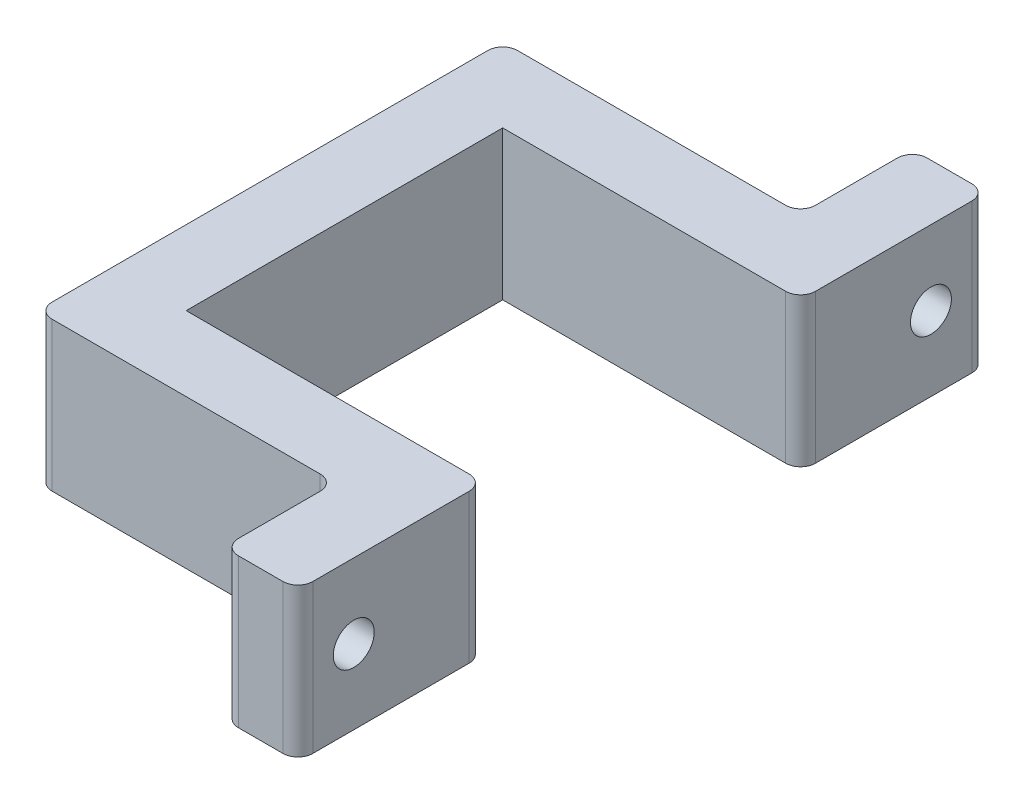
ISO-10303-21;
HEADER;
FILE_DESCRIPTION(('STEP AP214'),'2;1');
FILE_NAME('part.step','',(''),(''),'','','');
FILE_SCHEMA(('AUTOMOTIVE_DESIGN { 1 0 10303 214 1 1 1 1 }'));
ENDSEC;
DATA;
#1=APPLICATION_CONTEXT('core data for automotive mechanical design processes');
#2=APPLICATION_PROTOCOL_DEFINITION('international standard','automotive_design',2000,#1);
#3=PRODUCT_CONTEXT('',#1,'mechanical');
#4=PRODUCT('Part','Part','',(#3));
#5=PRODUCT_RELATED_PRODUCT_CATEGORY('part','',(#4));
#6=PRODUCT_DEFINITION_FORMATION('','',#4);
#7=PRODUCT_DEFINITION_CONTEXT('part definition',#1,'design');
#8=PRODUCT_DEFINITION('design','',#6,#7);
#9=PRODUCT_DEFINITION_SHAPE('','',#8);
#10=(LENGTH_UNIT() NAMED_UNIT(*) SI_UNIT(.MILLI.,.METRE.));
#11=(NAMED_UNIT(*) PLANE_ANGLE_UNIT() SI_UNIT($,.RADIAN.));
#12=(NAMED_UNIT(*) SI_UNIT($,.STERADIAN.) SOLID_ANGLE_UNIT());
#13=UNCERTAINTY_MEASURE_WITH_UNIT(LENGTH_MEASURE(1.E-05),#10,'distance_accuracy_value','');
#14=(GEOMETRIC_REPRESENTATION_CONTEXT(3) GLOBAL_UNCERTAINTY_ASSIGNED_CONTEXT((#13)) GLOBAL_UNIT_ASSIGNED_CONTEXT((#10,
#11,#12)) REPRESENTATION_CONTEXT('',''));
#15=CARTESIAN_POINT('',(0.,0.,0.));
#16=DIRECTION('',(0.,0.,1.));
#17=DIRECTION('',(1.,0.,0.));
#18=AXIS2_PLACEMENT_3D('',#15,#16,#17);
#19=CARTESIAN_POINT('',(-25.3749999999986,0.,62.9966650051943));
#20=DIRECTION('',(-1.,0.,0.));
#21=DIRECTION('',(0.,0.,1.));
#22=AXIS2_PLACEMENT_3D('',#19,#20,#21);
#23=PLANE('',#22);
#24=CARTESIAN_POINT('',(-25.3749999999986,-10.,70.4966650051942));
#25=DIRECTION('',(-1.,0.,0.));
#26=DIRECTION('',(0.,0.,1.));
#27=AXIS2_PLACEMENT_3D('',#24,#25,#26);
#28=CIRCLE('',#27,2.75000000000001);
#29=CARTESIAN_POINT('',(-25.3749999999986,-10.,73.2466650051942));
#30=VERTEX_POINT('',#29);
#31=EDGE_CURVE('E236',#30,#30,#28,.T.);
#32=ORIENTED_EDGE('',*,*,#31,.F.);
#33=EDGE_LOOP('',(#32));
#34=FACE_BOUND('',#33,.T.);
#35=DIRECTION('',(0.,0.,-1.));
#36=VECTOR('',#35,1.);
#37=CARTESIAN_POINT('',(-25.3749999999986,-20.,62.9966650051943));
#38=LINE('',#37,#36);
#39=CARTESIAN_POINT('',(-25.3749999999986,-20.,75.9966650051943));
#40=VERTEX_POINT('',#39);
#41=CARTESIAN_POINT('',(-25.3749999999986,-20.,64.9966650051943));
#42=VERTEX_POINT('',#41);
#43=EDGE_CURVE('E232',#40,#42,#38,.T.);
#44=ORIENTED_EDGE('',*,*,#43,.F.);
#45=DIRECTION('',(0.,-1.,0.));
#46=VECTOR('',#45,1.);
#47=CARTESIAN_POINT('',(-25.3749999999986,0.,75.9966650051943));
#48=LINE('',#47,#46);
#49=CARTESIAN_POINT('',(-25.3749999999986,0.,75.9966650051943));
#50=VERTEX_POINT('',#49);
#51=EDGE_CURVE('E276',#40,#50,#48,.F.);
#52=ORIENTED_EDGE('',*,*,#51,.T.);
#53=DIRECTION('',(0.,0.,-1.));
#54=VECTOR('',#53,1.);
#55=CARTESIAN_POINT('',(-25.3749999999986,0.,62.9966650051943));
#56=LINE('',#55,#54);
#57=CARTESIAN_POINT('',(-25.3749999999986,0.,64.9966650051943));
#58=VERTEX_POINT('',#57);
#59=EDGE_CURVE('E266',#50,#58,#56,.T.);
#60=ORIENTED_EDGE('',*,*,#59,.T.);
#61=DIRECTION('',(0.,-1.,0.));
#62=VECTOR('',#61,1.);
#63=CARTESIAN_POINT('',(-25.3749999999986,0.,64.9966650051943));
#64=LINE('',#63,#62);
#65=EDGE_CURVE('E273',#58,#42,#64,.T.);
#66=ORIENTED_EDGE('',*,*,#65,.T.);
#67=EDGE_LOOP('',(#44,#52,#60,#66));
#68=FACE_BOUND('',#67,.T.);
#69=ADVANCED_FACE('F35',(#34,#68),#23,.T.);
#70=CARTESIAN_POINT('',(-25.3749999999986,0.,77.9966650051943));
#71=DIRECTION('',(0.,0.,-1.));
#72=DIRECTION('',(-1.,0.,0.));
#73=AXIS2_PLACEMENT_3D('',#70,#71,#72);
#74=PLANE('',#73);
#75=DIRECTION('',(1.,0.,0.));
#76=VECTOR('',#75,1.);
#77=CARTESIAN_POINT('',(-25.3749999999986,0.,77.9966650051943));
#78=LINE('',#77,#76);
#79=CARTESIAN_POINT('',(-63.3749999999986,0.,77.9966650051943));
#80=VERTEX_POINT('',#79);
#81=CARTESIAN_POINT('',(-27.3749999999986,0.,77.9966650051943));
#82=VERTEX_POINT('',#81);
#83=EDGE_CURVE('E204',#80,#82,#78,.T.);
#84=ORIENTED_EDGE('',*,*,#83,.T.);
#85=DIRECTION('',(0.,-1.,0.));
#86=VECTOR('',#85,1.);
#87=CARTESIAN_POINT('',(-27.3749999999986,-20.,77.9966650051943));
#88=LINE('',#87,#86);
#89=CARTESIAN_POINT('',(-27.3749999999986,-20.,77.9966650051943));
#90=VERTEX_POINT('',#89);
#91=EDGE_CURVE('E270',#82,#90,#88,.T.);
#92=ORIENTED_EDGE('',*,*,#91,.T.);
#93=DIRECTION('',(1.,0.,0.));
#94=VECTOR('',#93,1.);
#95=CARTESIAN_POINT('',(-25.3749999999986,-20.,77.9966650051943));
#96=LINE('',#95,#94);
#97=CARTESIAN_POINT('',(-63.3749999999986,-20.,77.9966650051943));
#98=VERTEX_POINT('',#97);
#99=EDGE_CURVE('E263',#98,#90,#96,.T.);
#100=ORIENTED_EDGE('',*,*,#99,.F.);
#101=DIRECTION('',(0.,-1.,0.));
#102=VECTOR('',#101,1.);
#103=CARTESIAN_POINT('',(-63.3749999999986,0.,77.9966650051943));
#104=LINE('',#103,#102);
#105=EDGE_CURVE('E267',#98,#80,#104,.F.);
#106=ORIENTED_EDGE('',*,*,#105,.T.);
#107=EDGE_LOOP('',(#84,#92,#100,#106));
#108=FACE_BOUND('',#107,.T.);
#109=ADVANCED_FACE('F420',(#108),#74,.T.);
#110=CARTESIAN_POINT('',(-65.3749999999986,0.,77.9966650051943));
#111=DIRECTION('',(-1.,0.,0.));
#112=DIRECTION('',(0.,0.,1.));
#113=AXIS2_PLACEMENT_3D('',#110,#111,#112);
#114=PLANE('',#113);
#115=DIRECTION('',(0.,0.,-1.));
#116=VECTOR('',#115,1.);
#117=CARTESIAN_POINT('',(-65.3749999999986,-20.,77.9966650051943));
#118=LINE('',#117,#116);
#119=CARTESIAN_POINT('',(-65.3749999999986,-20.,138.496665005194));
#120=VERTEX_POINT('',#119);
#121=CARTESIAN_POINT('',(-65.3749999999986,-20.,79.9966650051943));
#122=VERTEX_POINT('',#121);
#123=EDGE_CURVE('E260',#120,#122,#118,.T.);
#124=ORIENTED_EDGE('',*,*,#123,.F.);
#125=DIRECTION('',(0.,-1.,0.));
#126=VECTOR('',#125,1.);
#127=CARTESIAN_POINT('',(-65.3749999999986,0.,138.496665005194));
#128=LINE('',#127,#126);
#129=CARTESIAN_POINT('',(-65.3749999999986,0.,138.496665005194));
#130=VERTEX_POINT('',#129);
#131=EDGE_CURVE('E335',#120,#130,#128,.F.);
#132=ORIENTED_EDGE('',*,*,#131,.T.);
#133=DIRECTION('',(0.,0.,-1.));
#134=VECTOR('',#133,1.);
#135=CARTESIAN_POINT('',(-65.3749999999986,0.,77.9966650051943));
#136=LINE('',#135,#134);
#137=CARTESIAN_POINT('',(-65.3749999999986,0.,79.9966650051943));
#138=VERTEX_POINT('',#137);
#139=EDGE_CURVE('E227',#130,#138,#136,.T.);
#140=ORIENTED_EDGE('',*,*,#139,.T.);
#141=DIRECTION('',(0.,-1.,0.));
#142=VECTOR('',#141,1.);
#143=CARTESIAN_POINT('',(-65.3749999999986,0.,79.9966650051943));
#144=LINE('',#143,#142);
#145=EDGE_CURVE('E332',#138,#122,#144,.T.);
#146=ORIENTED_EDGE('',*,*,#145,.T.);
#147=EDGE_LOOP('',(#124,#132,#140,#146));
#148=FACE_BOUND('',#147,.T.);
#149=ADVANCED_FACE('F442',(#148),#114,.T.);
#150=CARTESIAN_POINT('',(-65.3749999999986,0.,140.496665005194));
#151=DIRECTION('',(0.,0.,1.));
#152=DIRECTION('',(1.,0.,0.));
#153=AXIS2_PLACEMENT_3D('',#150,#151,#152);
#154=PLANE('',#153);
#155=DIRECTION('',(-1.,0.,0.));
#156=VECTOR('',#155,1.);
#157=CARTESIAN_POINT('',(-65.3749999999986,-20.,140.496665005194));
#158=LINE('',#157,#156);
#159=CARTESIAN_POINT('',(-27.3749999999986,-20.,140.496665005194));
#160=VERTEX_POINT('',#159);
#161=CARTESIAN_POINT('',(-63.3749999999986,-20.,140.496665005194));
#162=VERTEX_POINT('',#161);
#163=EDGE_CURVE('E257',#160,#162,#158,.T.);
#164=ORIENTED_EDGE('',*,*,#163,.F.);
#165=DIRECTION('',(0.,-1.,0.));
#166=VECTOR('',#165,1.);
#167=CARTESIAN_POINT('',(-27.3749999999986,0.,140.496665005194));
#168=LINE('',#167,#166);
#169=CARTESIAN_POINT('',(-27.3749999999986,0.,140.496665005194));
#170=VERTEX_POINT('',#169);
#171=EDGE_CURVE('E330',#160,#170,#168,.F.);
#172=ORIENTED_EDGE('',*,*,#171,.T.);
#173=DIRECTION('',(-1.,0.,0.));
#174=VECTOR('',#173,1.);
#175=CARTESIAN_POINT('',(-65.3749999999986,0.,140.496665005194));
#176=LINE('',#175,#174);
#177=CARTESIAN_POINT('',(-63.3749999999986,0.,140.496665005194));
#178=VERTEX_POINT('',#177);
#179=EDGE_CURVE('E224',#170,#178,#176,.T.);
#180=ORIENTED_EDGE('',*,*,#179,.T.);
#181=DIRECTION('',(0.,-1.,0.));
#182=VECTOR('',#181,1.);
#183=CARTESIAN_POINT('',(-63.3749999999986,0.,140.496665005194));
#184=LINE('',#183,#182);
#185=EDGE_CURVE('E327',#178,#162,#184,.T.);
#186=ORIENTED_EDGE('',*,*,#185,.T.);
#187=EDGE_LOOP('',(#164,#172,#180,#186));
#188=FACE_BOUND('',#187,.T.);
#189=ADVANCED_FACE('F358',(#188),#154,.T.);
#190=CARTESIAN_POINT('',(-25.3749999999986,0.,140.496665005194));
#191=DIRECTION('',(-1.,0.,0.));
#192=DIRECTION('',(0.,0.,1.));
#193=AXIS2_PLACEMENT_3D('',#190,#191,#192);
#194=PLANE('',#193);
#195=CARTESIAN_POINT('',(-25.3749999999986,-10.,147.996665005194));
#196=DIRECTION('',(-1.,0.,0.));
#197=DIRECTION('',(0.,0.,-1.));
#198=AXIS2_PLACEMENT_3D('',#195,#196,#197);
#199=CIRCLE('',#198,2.75000000000001);
#200=CARTESIAN_POINT('',(-25.3749999999986,-10.,150.746665005194));
#201=VERTEX_POINT('',#200);
#202=EDGE_CURVE('E407',#201,#201,#199,.T.);
#203=ORIENTED_EDGE('',*,*,#202,.F.);
#204=EDGE_LOOP('',(#203));
#205=FACE_BOUND('',#204,.T.);
#206=DIRECTION('',(0.,0.,-1.));
#207=VECTOR('',#206,1.);
#208=CARTESIAN_POINT('',(-25.3749999999986,-20.,140.496665005194));
#209=LINE('',#208,#207);
#210=CARTESIAN_POINT('',(-25.3749999999986,-20.,153.496665005194));
#211=VERTEX_POINT('',#210);
#212=CARTESIAN_POINT('',(-25.3749999999986,-20.,142.496665005194));
#213=VERTEX_POINT('',#212);
#214=EDGE_CURVE('E254',#211,#213,#209,.T.);
#215=ORIENTED_EDGE('',*,*,#214,.F.);
#216=DIRECTION('',(0.,-1.,0.));
#217=VECTOR('',#216,1.);
#218=CARTESIAN_POINT('',(-25.3749999999986,0.,153.496665005194));
#219=LINE('',#218,#217);
#220=CARTESIAN_POINT('',(-25.3749999999986,0.,153.496665005194));
#221=VERTEX_POINT('',#220);
#222=EDGE_CURVE('E325',#211,#221,#219,.F.);
#223=ORIENTED_EDGE('',*,*,#222,.T.);
#224=DIRECTION('',(0.,0.,-1.));
#225=VECTOR('',#224,1.);
#226=CARTESIAN_POINT('',(-25.3749999999986,0.,140.496665005194));
#227=LINE('',#226,#225);
#228=CARTESIAN_POINT('',(-25.3749999999986,0.,142.496665005194));
#229=VERTEX_POINT('',#228);
#230=EDGE_CURVE('E221',#221,#229,#227,.T.);
#231=ORIENTED_EDGE('',*,*,#230,.T.);
#232=DIRECTION('',(0.,-1.,0.));
#233=VECTOR('',#232,1.);
#234=CARTESIAN_POINT('',(-25.3749999999986,-20.,142.496665005194));
#235=LINE('',#234,#233);
#236=EDGE_CURVE('E322',#229,#213,#235,.T.);
#237=ORIENTED_EDGE('',*,*,#236,.T.);
#238=EDGE_LOOP('',(#215,#223,#231,#237));
#239=FACE_BOUND('',#238,.T.);
#240=ADVANCED_FACE('F366',(#205,#239),#194,.T.);
#241=CARTESIAN_POINT('',(-25.3749999999986,0.,155.496665005194));
#242=DIRECTION('',(0.,0.,1.));
#243=DIRECTION('',(1.,0.,0.));
#244=AXIS2_PLACEMENT_3D('',#241,#242,#243);
#245=PLANE('',#244);
#246=DIRECTION('',(-1.,0.,0.));
#247=VECTOR('',#246,1.);
#248=CARTESIAN_POINT('',(-25.3749999999986,-20.,155.496665005194));
#249=LINE('',#248,#247);
#250=CARTESIAN_POINT('',(-17.3749999999986,-20.,155.496665005194));
#251=VERTEX_POINT('',#250);
#252=CARTESIAN_POINT('',(-23.3749999999986,-20.,155.496665005194));
#253=VERTEX_POINT('',#252);
#254=EDGE_CURVE('E251',#251,#253,#249,.T.);
#255=ORIENTED_EDGE('',*,*,#254,.F.);
#256=DIRECTION('',(0.,-1.,0.));
#257=VECTOR('',#256,1.);
#258=CARTESIAN_POINT('',(-17.3749999999986,0.,155.496665005194));
#259=LINE('',#258,#257);
#260=CARTESIAN_POINT('',(-17.3749999999986,0.,155.496665005194));
#261=VERTEX_POINT('',#260);
#262=EDGE_CURVE('E320',#251,#261,#259,.F.);
#263=ORIENTED_EDGE('',*,*,#262,.T.);
#264=DIRECTION('',(-1.,0.,0.));
#265=VECTOR('',#264,1.);
#266=CARTESIAN_POINT('',(-25.3749999999986,0.,155.496665005194));
#267=LINE('',#266,#265);
#268=CARTESIAN_POINT('',(-23.3749999999986,0.,155.496665005194));
#269=VERTEX_POINT('',#268);
#270=EDGE_CURVE('E218',#261,#269,#267,.T.);
#271=ORIENTED_EDGE('',*,*,#270,.T.);
#272=DIRECTION('',(0.,-1.,0.));
#273=VECTOR('',#272,1.);
#274=CARTESIAN_POINT('',(-23.3749999999986,0.,155.496665005194));
#275=LINE('',#274,#273);
#276=EDGE_CURVE('E317',#269,#253,#275,.T.);
#277=ORIENTED_EDGE('',*,*,#276,.T.);
#278=EDGE_LOOP('',(#255,#263,#271,#277));
#279=FACE_BOUND('',#278,.T.);
#280=ADVANCED_FACE('F375',(#279),#245,.T.);
#281=CARTESIAN_POINT('',(-15.3749999999986,0.,155.496665005194));
#282=DIRECTION('',(1.,0.,0.));
#283=DIRECTION('',(0.,0.,-1.));
#284=AXIS2_PLACEMENT_3D('',#281,#282,#283);
#285=PLANE('',#284);
#286=CARTESIAN_POINT('',(-15.3749999999986,-10.,147.996665005194));
#287=DIRECTION('',(1.,0.,0.));
#288=DIRECTION('',(0.,0.,-1.));
#289=AXIS2_PLACEMENT_3D('',#286,#287,#288);
#290=CIRCLE('',#289,2.75000000000001);
#291=CARTESIAN_POINT('',(-15.3749999999986,-10.,150.746665005194));
#292=VERTEX_POINT('',#291);
#293=EDGE_CURVE('E404',#292,#292,#290,.F.);
#294=ORIENTED_EDGE('',*,*,#293,.T.);
#295=EDGE_LOOP('',(#294));
#296=FACE_BOUND('',#295,.T.);
#297=DIRECTION('',(0.,0.,1.));
#298=VECTOR('',#297,1.);
#299=CARTESIAN_POINT('',(-15.3749999999986,-20.,155.496665005194));
#300=LINE('',#299,#298);
#301=CARTESIAN_POINT('',(-15.3749999999986,-20.,132.496665005194));
#302=VERTEX_POINT('',#301);
#303=CARTESIAN_POINT('',(-15.3749999999986,-20.,153.496665005194));
#304=VERTEX_POINT('',#303);
#305=EDGE_CURVE('E248',#302,#304,#300,.T.);
#306=ORIENTED_EDGE('',*,*,#305,.F.);
#307=DIRECTION('',(0.,-1.,0.));
#308=VECTOR('',#307,1.);
#309=CARTESIAN_POINT('',(-15.3749999999986,0.,132.496665005194));
#310=LINE('',#309,#308);
#311=CARTESIAN_POINT('',(-15.3749999999986,0.,132.496665005194));
#312=VERTEX_POINT('',#311);
#313=EDGE_CURVE('E300',#302,#312,#310,.F.);
#314=ORIENTED_EDGE('',*,*,#313,.T.);
#315=DIRECTION('',(0.,0.,1.));
#316=VECTOR('',#315,1.);
#317=CARTESIAN_POINT('',(-15.3749999999986,0.,155.496665005194));
#318=LINE('',#317,#316);
#319=CARTESIAN_POINT('',(-15.3749999999986,0.,153.496665005194));
#320=VERTEX_POINT('',#319);
#321=EDGE_CURVE('E212',#312,#320,#318,.T.);
#322=ORIENTED_EDGE('',*,*,#321,.T.);
#323=DIRECTION('',(0.,-1.,0.));
#324=VECTOR('',#323,1.);
#325=CARTESIAN_POINT('',(-15.3749999999986,0.,153.496665005194));
#326=LINE('',#325,#324);
#327=EDGE_CURVE('E297',#320,#304,#326,.T.);
#328=ORIENTED_EDGE('',*,*,#327,.T.);
#329=EDGE_LOOP('',(#306,#314,#322,#328));
#330=FACE_BOUND('',#329,.T.);
#331=ADVANCED_FACE('F383',(#296,#330),#285,.T.);
#332=CARTESIAN_POINT('',(-15.3749999999986,0.,130.496665005194));
#333=DIRECTION('',(0.,0.,-1.));
#334=DIRECTION('',(-1.,0.,0.));
#335=AXIS2_PLACEMENT_3D('',#332,#333,#334);
#336=PLANE('',#335);
#337=DIRECTION('',(1.,0.,0.));
#338=VECTOR('',#337,1.);
#339=CARTESIAN_POINT('',(-15.3749999999986,0.,130.496665005194));
#340=LINE('',#339,#338);
#341=CARTESIAN_POINT('',(-55.3749999999986,0.,130.496665005194));
#342=VERTEX_POINT('',#341);
#343=CARTESIAN_POINT('',(-17.3749999999986,0.,130.496665005194));
#344=VERTEX_POINT('',#343);
#345=EDGE_CURVE('E210',#342,#344,#340,.T.);
#346=ORIENTED_EDGE('',*,*,#345,.T.);
#347=DIRECTION('',(0.,-1.,0.));
#348=VECTOR('',#347,1.);
#349=CARTESIAN_POINT('',(-17.3749999999986,0.,130.496665005194));
#350=LINE('',#349,#348);
#351=CARTESIAN_POINT('',(-17.3749999999986,-20.,130.496665005194));
#352=VERTEX_POINT('',#351);
#353=EDGE_CURVE('E278',#344,#352,#350,.T.);
#354=ORIENTED_EDGE('',*,*,#353,.T.);
#355=DIRECTION('',(1.,0.,0.));
#356=VECTOR('',#355,1.);
#357=CARTESIAN_POINT('',(-15.3749999999986,-20.,130.496665005194));
#358=LINE('',#357,#356);
#359=CARTESIAN_POINT('',(-55.3749999999986,-20.,130.496665005194));
#360=VERTEX_POINT('',#359);
#361=EDGE_CURVE('E245',#360,#352,#358,.T.);
#362=ORIENTED_EDGE('',*,*,#361,.F.);
#363=DIRECTION('',(0.,-1.,0.));
#364=VECTOR('',#363,1.);
#365=CARTESIAN_POINT('',(-55.3749999999986,0.,130.496665005194));
#366=LINE('',#365,#364);
#367=EDGE_CURVE('E203',#342,#360,#366,.T.);
#368=ORIENTED_EDGE('',*,*,#367,.F.);
#369=EDGE_LOOP('',(#346,#354,#362,#368));
#370=FACE_BOUND('',#369,.T.);
#371=ADVANCED_FACE('F389',(#370),#336,.T.);
#372=CARTESIAN_POINT('',(-55.3749999999986,0.,130.496665005194));
#373=DIRECTION('',(1.,0.,0.));
#374=DIRECTION('',(0.,0.,-1.));
#375=AXIS2_PLACEMENT_3D('',#372,#373,#374);
#376=PLANE('',#375);
#377=DIRECTION('',(0.,0.,1.));
#378=VECTOR('',#377,1.);
#379=CARTESIAN_POINT('',(-55.3749999999986,-20.,130.496665005194));
#380=LINE('',#379,#378);
#381=CARTESIAN_POINT('',(-55.3749999999986,-20.,87.9966650051943));
#382=VERTEX_POINT('',#381);
#383=EDGE_CURVE('E202',#382,#360,#380,.T.);
#384=ORIENTED_EDGE('',*,*,#383,.F.);
#385=DIRECTION('',(0.,-1.,0.));
#386=VECTOR('',#385,1.);
#387=CARTESIAN_POINT('',(-55.3749999999986,0.,87.9966650051943));
#388=LINE('',#387,#386);
#389=CARTESIAN_POINT('',(-55.3749999999986,0.,87.9966650051943));
#390=VERTEX_POINT('',#389);
#391=EDGE_CURVE('E189',#390,#382,#388,.T.);
#392=ORIENTED_EDGE('',*,*,#391,.F.);
#393=DIRECTION('',(0.,0.,1.));
#394=VECTOR('',#393,1.);
#395=CARTESIAN_POINT('',(-55.3749999999986,0.,130.496665005194));
#396=LINE('',#395,#394);
#397=EDGE_CURVE('E195',#390,#342,#396,.T.);
#398=ORIENTED_EDGE('',*,*,#397,.T.);
#399=ORIENTED_EDGE('',*,*,#367,.T.);
#400=EDGE_LOOP('',(#384,#392,#398,#399));
#401=FACE_BOUND('',#400,.T.);
#402=ADVANCED_FACE('F200',(#401),#376,.T.);
#403=CARTESIAN_POINT('',(-55.3749999999986,0.,87.9966650051943));
#404=DIRECTION('',(0.,0.,1.));
#405=DIRECTION('',(1.,0.,0.));
#406=AXIS2_PLACEMENT_3D('',#403,#404,#405);
#407=PLANE('',#406);
#408=DIRECTION('',(-1.,0.,0.));
#409=VECTOR('',#408,1.);
#410=CARTESIAN_POINT('',(-55.3749999999986,-20.,87.9966650051943));
#411=LINE('',#410,#409);
#412=CARTESIAN_POINT('',(-17.3749999999986,-20.,87.9966650051943));
#413=VERTEX_POINT('',#412);
#414=EDGE_CURVE('E242',#413,#382,#411,.T.);
#415=ORIENTED_EDGE('',*,*,#414,.F.);
#416=DIRECTION('',(0.,-1.,0.));
#417=VECTOR('',#416,1.);
#418=CARTESIAN_POINT('',(-17.3749999999986,0.,87.9966650051943));
#419=LINE('',#418,#417);
#420=CARTESIAN_POINT('',(-17.3749999999986,0.,87.9966650051943));
#421=VERTEX_POINT('',#420);
#422=EDGE_CURVE('E192',#413,#421,#419,.F.);
#423=ORIENTED_EDGE('',*,*,#422,.T.);
#424=DIRECTION('',(-1.,0.,0.));
#425=VECTOR('',#424,1.);
#426=CARTESIAN_POINT('',(-55.3749999999986,0.,87.9966650051943));
#427=LINE('',#426,#425);
#428=EDGE_CURVE('E185',#421,#390,#427,.T.);
#429=ORIENTED_EDGE('',*,*,#428,.T.);
#430=ORIENTED_EDGE('',*,*,#391,.T.);
#431=EDGE_LOOP('',(#415,#423,#429,#430));
#432=FACE_BOUND('',#431,.T.);
#433=ADVANCED_FACE('F188',(#432),#407,.T.);
#434=CARTESIAN_POINT('',(-15.3749999999986,0.,87.9966650051943));
#435=DIRECTION('',(1.,0.,0.));
#436=DIRECTION('',(0.,0.,-1.));
#437=AXIS2_PLACEMENT_3D('',#434,#435,#436);
#438=PLANE('',#437);
#439=CARTESIAN_POINT('',(-15.3749999999986,-10.,70.4966650051942));
#440=DIRECTION('',(1.,0.,0.));
#441=DIRECTION('',(0.,0.,-1.));
#442=AXIS2_PLACEMENT_3D('',#439,#440,#441);
#443=CIRCLE('',#442,2.75000000000001);
#444=CARTESIAN_POINT('',(-15.3749999999986,-10.,73.2466650051942));
#445=VERTEX_POINT('',#444);
#446=EDGE_CURVE('E410',#445,#445,#443,.F.);
#447=ORIENTED_EDGE('',*,*,#446,.T.);
#448=EDGE_LOOP('',(#447));
#449=FACE_BOUND('',#448,.T.);
#450=DIRECTION('',(0.,0.,1.));
#451=VECTOR('',#450,1.);
#452=CARTESIAN_POINT('',(-15.3749999999986,0.,87.9966650051943));
#453=LINE('',#452,#451);
#454=CARTESIAN_POINT('',(-15.3749999999986,0.,64.9966650051943));
#455=VERTEX_POINT('',#454);
#456=CARTESIAN_POINT('',(-15.3749999999986,0.,85.9966650051943));
#457=VERTEX_POINT('',#456);
#458=EDGE_CURVE('E196',#455,#457,#453,.T.);
#459=ORIENTED_EDGE('',*,*,#458,.T.);
#460=DIRECTION('',(0.,-1.,0.));
#461=VECTOR('',#460,1.);
#462=CARTESIAN_POINT('',(-15.3749999999986,0.,85.9966650051943));
#463=LINE('',#462,#461);
#464=CARTESIAN_POINT('',(-15.3749999999986,-20.,85.9966650051943));
#465=VERTEX_POINT('',#464);
#466=EDGE_CURVE('E339',#457,#465,#463,.T.);
#467=ORIENTED_EDGE('',*,*,#466,.T.);
#468=DIRECTION('',(0.,0.,1.));
#469=VECTOR('',#468,1.);
#470=CARTESIAN_POINT('',(-15.3749999999986,-20.,87.9966650051943));
#471=LINE('',#470,#469);
#472=CARTESIAN_POINT('',(-15.3749999999986,-20.,64.9966650051943));
#473=VERTEX_POINT('',#472);
#474=EDGE_CURVE('E239',#473,#465,#471,.T.);
#475=ORIENTED_EDGE('',*,*,#474,.F.);
#476=DIRECTION('',(0.,-1.,0.));
#477=VECTOR('',#476,1.);
#478=CARTESIAN_POINT('',(-15.3749999999986,0.,64.9966650051943));
#479=LINE('',#478,#477);
#480=EDGE_CURVE('E337',#473,#455,#479,.F.);
#481=ORIENTED_EDGE('',*,*,#480,.T.);
#482=EDGE_LOOP('',(#459,#467,#475,#481));
#483=FACE_BOUND('',#482,.T.);
#484=ADVANCED_FACE('F396',(#449,#483),#438,.T.);
#485=CARTESIAN_POINT('',(-15.3749999999986,0.,62.9966650051943));
#486=DIRECTION('',(0.,0.,-1.));
#487=DIRECTION('',(-1.,0.,0.));
#488=AXIS2_PLACEMENT_3D('',#485,#486,#487);
#489=PLANE('',#488);
#490=DIRECTION('',(1.,0.,0.));
#491=VECTOR('',#490,1.);
#492=CARTESIAN_POINT('',(-15.3749999999986,0.,62.9966650051943));
#493=LINE('',#492,#491);
#494=CARTESIAN_POINT('',(-23.3749999999986,0.,62.9966650051943));
#495=VERTEX_POINT('',#494);
#496=CARTESIAN_POINT('',(-17.3749999999986,0.,62.9966650051943));
#497=VERTEX_POINT('',#496);
#498=EDGE_CURVE('E399',#495,#497,#493,.T.);
#499=ORIENTED_EDGE('',*,*,#498,.T.);
#500=DIRECTION('',(0.,-1.,0.));
#501=VECTOR('',#500,1.);
#502=CARTESIAN_POINT('',(-17.3749999999986,0.,62.9966650051943));
#503=LINE('',#502,#501);
#504=CARTESIAN_POINT('',(-17.3749999999986,-20.,62.9966650051943));
#505=VERTEX_POINT('',#504);
#506=EDGE_CURVE('E344',#497,#505,#503,.T.);
#507=ORIENTED_EDGE('',*,*,#506,.T.);
#508=DIRECTION('',(1.,0.,0.));
#509=VECTOR('',#508,1.);
#510=CARTESIAN_POINT('',(-15.3749999999986,-20.,62.9966650051943));
#511=LINE('',#510,#509);
#512=CARTESIAN_POINT('',(-23.3749999999986,-20.,62.9966650051943));
#513=VERTEX_POINT('',#512);
#514=EDGE_CURVE('E235',#513,#505,#511,.T.);
#515=ORIENTED_EDGE('',*,*,#514,.F.);
#516=DIRECTION('',(0.,-1.,0.));
#517=VECTOR('',#516,1.);
#518=CARTESIAN_POINT('',(-23.3749999999986,0.,62.9966650051943));
#519=LINE('',#518,#517);
#520=EDGE_CURVE('E57',#513,#495,#519,.F.);
#521=ORIENTED_EDGE('',*,*,#520,.T.);
#522=EDGE_LOOP('',(#499,#507,#515,#521));
#523=FACE_BOUND('',#522,.T.);
#524=ADVANCED_FACE('F465',(#523),#489,.T.);
#525=CARTESIAN_POINT('',(0.,0.,0.));
#526=DIRECTION('',(0.,-1.,0.));
#527=DIRECTION('',(0.,0.,-1.));
#528=AXIS2_PLACEMENT_3D('',#525,#526,#527);
#529=PLANE('',#528);
#530=ORIENTED_EDGE('',*,*,#321,.F.);
#531=CARTESIAN_POINT('',(-17.3749999999986,0.,132.496665005194));
#532=DIRECTION('',(0.,-1.,0.));
#533=DIRECTION('',(0.,0.,-1.));
#534=AXIS2_PLACEMENT_3D('',#531,#532,#533);
#535=CIRCLE('',#534,2.);
#536=EDGE_CURVE('E315',#312,#344,#535,.F.);
#537=ORIENTED_EDGE('',*,*,#536,.T.);
#538=ORIENTED_EDGE('',*,*,#345,.F.);
#539=ORIENTED_EDGE('',*,*,#397,.F.);
#540=ORIENTED_EDGE('',*,*,#428,.F.);
#541=CARTESIAN_POINT('',(-17.3749999999986,0.,85.9966650051943));
#542=DIRECTION('',(0.,-1.,0.));
#543=DIRECTION('',(0.,0.,-1.));
#544=AXIS2_PLACEMENT_3D('',#541,#542,#543);
#545=CIRCLE('',#544,2.);
#546=EDGE_CURVE('E307',#421,#457,#545,.F.);
#547=ORIENTED_EDGE('',*,*,#546,.T.);
#548=ORIENTED_EDGE('',*,*,#458,.F.);
#549=CARTESIAN_POINT('',(-17.3749999999986,0.,64.9966650051943));
#550=DIRECTION('',(0.,-1.,0.));
#551=DIRECTION('',(0.,0.,-1.));
#552=AXIS2_PLACEMENT_3D('',#549,#550,#551);
#553=CIRCLE('',#552,2.);
#554=EDGE_CURVE('E50',#455,#497,#553,.F.);
#555=ORIENTED_EDGE('',*,*,#554,.T.);
#556=ORIENTED_EDGE('',*,*,#498,.F.);
#557=CARTESIAN_POINT('',(-23.3749999999986,0.,64.9966650051943));
#558=DIRECTION('',(0.,-1.,0.));
#559=DIRECTION('',(0.,0.,-1.));
#560=AXIS2_PLACEMENT_3D('',#557,#558,#559);
#561=CIRCLE('',#560,2.);
#562=EDGE_CURVE('E302',#495,#58,#561,.F.);
#563=ORIENTED_EDGE('',*,*,#562,.T.);
#564=ORIENTED_EDGE('',*,*,#59,.F.);
#565=CARTESIAN_POINT('',(-27.3749999999986,0.,75.9966650051943));
#566=DIRECTION('',(0.,-1.,0.));
#567=DIRECTION('',(0.,0.,-1.));
#568=AXIS2_PLACEMENT_3D('',#565,#566,#567);
#569=CIRCLE('',#568,2.);
#570=EDGE_CURVE('E349',#50,#82,#569,.T.);
#571=ORIENTED_EDGE('',*,*,#570,.T.);
#572=ORIENTED_EDGE('',*,*,#83,.F.);
#573=CARTESIAN_POINT('',(-63.3749999999986,0.,79.9966650051943));
#574=DIRECTION('',(0.,-1.,0.));
#575=DIRECTION('',(0.,0.,-1.));
#576=AXIS2_PLACEMENT_3D('',#573,#574,#575);
#577=CIRCLE('',#576,2.);
#578=EDGE_CURVE('E305',#80,#138,#577,.F.);
#579=ORIENTED_EDGE('',*,*,#578,.T.);
#580=ORIENTED_EDGE('',*,*,#139,.F.);
#581=CARTESIAN_POINT('',(-63.3749999999986,0.,138.496665005194));
#582=DIRECTION('',(0.,-1.,0.));
#583=DIRECTION('',(0.,0.,-1.));
#584=AXIS2_PLACEMENT_3D('',#581,#582,#583);
#585=CIRCLE('',#584,2.);
#586=EDGE_CURVE('E309',#130,#178,#585,.F.);
#587=ORIENTED_EDGE('',*,*,#586,.T.);
#588=ORIENTED_EDGE('',*,*,#179,.F.);
#589=CARTESIAN_POINT('',(-27.3749999999986,0.,142.496665005194));
#590=DIRECTION('',(0.,-1.,0.));
#591=DIRECTION('',(0.,0.,-1.));
#592=AXIS2_PLACEMENT_3D('',#589,#590,#591);
#593=CIRCLE('',#592,2.);
#594=EDGE_CURVE('E11',#170,#229,#593,.T.);
#595=ORIENTED_EDGE('',*,*,#594,.T.);
#596=ORIENTED_EDGE('',*,*,#230,.F.);
#597=CARTESIAN_POINT('',(-23.3749999999986,0.,153.496665005194));
#598=DIRECTION('',(0.,-1.,0.));
#599=DIRECTION('',(0.,0.,-1.));
#600=AXIS2_PLACEMENT_3D('',#597,#598,#599);
#601=CIRCLE('',#600,2.);
#602=EDGE_CURVE('E311',#221,#269,#601,.F.);
#603=ORIENTED_EDGE('',*,*,#602,.T.);
#604=ORIENTED_EDGE('',*,*,#270,.F.);
#605=CARTESIAN_POINT('',(-17.3749999999986,0.,153.496665005194));
#606=DIRECTION('',(0.,-1.,0.));
#607=DIRECTION('',(0.,0.,-1.));
#608=AXIS2_PLACEMENT_3D('',#605,#606,#607);
#609=CIRCLE('',#608,2.);
#610=EDGE_CURVE('E313',#261,#320,#609,.F.);
#611=ORIENTED_EDGE('',*,*,#610,.T.);
#612=EDGE_LOOP('',(#530,#537,#538,#539,#540,#547,#548,#555,#556,#563,#564,#571,#572,#579,#580,
#587,#588,#595,#596,#603,#604,#611));
#613=FACE_BOUND('',#612,.T.);
#614=ADVANCED_FACE('F208',(#613),#529,.F.);
#615=CARTESIAN_POINT('',(0.,-20.,0.));
#616=DIRECTION('',(0.,-1.,0.));
#617=DIRECTION('',(0.,0.,-1.));
#618=AXIS2_PLACEMENT_3D('',#615,#616,#617);
#619=PLANE('',#618);
#620=ORIENTED_EDGE('',*,*,#361,.T.);
#621=CARTESIAN_POINT('',(-17.3749999999986,-20.,132.496665005194));
#622=DIRECTION('',(0.,-1.,0.));
#623=DIRECTION('',(0.,0.,-1.));
#624=AXIS2_PLACEMENT_3D('',#621,#622,#623);
#625=CIRCLE('',#624,2.);
#626=EDGE_CURVE('E295',#352,#302,#625,.T.);
#627=ORIENTED_EDGE('',*,*,#626,.T.);
#628=ORIENTED_EDGE('',*,*,#305,.T.);
#629=CARTESIAN_POINT('',(-17.3749999999986,-20.,153.496665005194));
#630=DIRECTION('',(0.,-1.,0.));
#631=DIRECTION('',(0.,0.,-1.));
#632=AXIS2_PLACEMENT_3D('',#629,#630,#631);
#633=CIRCLE('',#632,2.);
#634=EDGE_CURVE('E293',#304,#251,#633,.T.);
#635=ORIENTED_EDGE('',*,*,#634,.T.);
#636=ORIENTED_EDGE('',*,*,#254,.T.);
#637=CARTESIAN_POINT('',(-23.3749999999986,-20.,153.496665005194));
#638=DIRECTION('',(0.,-1.,0.));
#639=DIRECTION('',(0.,0.,-1.));
#640=AXIS2_PLACEMENT_3D('',#637,#638,#639);
#641=CIRCLE('',#640,2.);
#642=EDGE_CURVE('E291',#253,#211,#641,.T.);
#643=ORIENTED_EDGE('',*,*,#642,.T.);
#644=ORIENTED_EDGE('',*,*,#214,.T.);
#645=CARTESIAN_POINT('',(-27.3749999999986,-20.,142.496665005194));
#646=DIRECTION('',(0.,-1.,0.));
#647=DIRECTION('',(0.,0.,-1.));
#648=AXIS2_PLACEMENT_3D('',#645,#646,#647);
#649=CIRCLE('',#648,2.);
#650=EDGE_CURVE('E43',#213,#160,#649,.F.);
#651=ORIENTED_EDGE('',*,*,#650,.T.);
#652=ORIENTED_EDGE('',*,*,#163,.T.);
#653=CARTESIAN_POINT('',(-63.3749999999986,-20.,138.496665005194));
#654=DIRECTION('',(0.,-1.,0.));
#655=DIRECTION('',(0.,0.,-1.));
#656=AXIS2_PLACEMENT_3D('',#653,#654,#655);
#657=CIRCLE('',#656,2.);
#658=EDGE_CURVE('E289',#162,#120,#657,.T.);
#659=ORIENTED_EDGE('',*,*,#658,.T.);
#660=ORIENTED_EDGE('',*,*,#123,.T.);
#661=CARTESIAN_POINT('',(-63.3749999999986,-20.,79.9966650051943));
#662=DIRECTION('',(0.,-1.,0.));
#663=DIRECTION('',(0.,0.,-1.));
#664=AXIS2_PLACEMENT_3D('',#661,#662,#663);
#665=CIRCLE('',#664,2.);
#666=EDGE_CURVE('E285',#122,#98,#665,.T.);
#667=ORIENTED_EDGE('',*,*,#666,.T.);
#668=ORIENTED_EDGE('',*,*,#99,.T.);
#669=CARTESIAN_POINT('',(-27.3749999999986,-20.,75.9966650051943));
#670=DIRECTION('',(0.,-1.,0.));
#671=DIRECTION('',(0.,0.,-1.));
#672=AXIS2_PLACEMENT_3D('',#669,#670,#671);
#673=CIRCLE('',#672,2.);
#674=EDGE_CURVE('E347',#90,#40,#673,.F.);
#675=ORIENTED_EDGE('',*,*,#674,.T.);
#676=ORIENTED_EDGE('',*,*,#43,.T.);
#677=CARTESIAN_POINT('',(-23.3749999999986,-20.,64.9966650051943));
#678=DIRECTION('',(0.,-1.,0.));
#679=DIRECTION('',(0.,0.,-1.));
#680=AXIS2_PLACEMENT_3D('',#677,#678,#679);
#681=CIRCLE('',#680,2.);
#682=EDGE_CURVE('E281',#42,#513,#681,.T.);
#683=ORIENTED_EDGE('',*,*,#682,.T.);
#684=ORIENTED_EDGE('',*,*,#514,.T.);
#685=CARTESIAN_POINT('',(-17.3749999999986,-20.,64.9966650051943));
#686=DIRECTION('',(0.,-1.,0.));
#687=DIRECTION('',(0.,0.,-1.));
#688=AXIS2_PLACEMENT_3D('',#685,#686,#687);
#689=CIRCLE('',#688,2.);
#690=EDGE_CURVE('E283',#505,#473,#689,.T.);
#691=ORIENTED_EDGE('',*,*,#690,.T.);
#692=ORIENTED_EDGE('',*,*,#474,.T.);
#693=CARTESIAN_POINT('',(-17.3749999999986,-20.,85.9966650051943));
#694=DIRECTION('',(0.,-1.,0.));
#695=DIRECTION('',(0.,0.,-1.));
#696=AXIS2_PLACEMENT_3D('',#693,#694,#695);
#697=CIRCLE('',#696,2.);
#698=EDGE_CURVE('E287',#465,#413,#697,.T.);
#699=ORIENTED_EDGE('',*,*,#698,.T.);
#700=ORIENTED_EDGE('',*,*,#414,.T.);
#701=ORIENTED_EDGE('',*,*,#383,.T.);
#702=EDGE_LOOP('',(#620,#627,#628,#635,#636,#643,#644,#651,#652,#659,#660,#667,#668,#675,#676,
#683,#684,#691,#692,#699,#700,#701));
#703=FACE_BOUND('',#702,.T.);
#704=ADVANCED_FACE('F352',(#703),#619,.T.);
#705=CARTESIAN_POINT('',(36.6260000086029,-10.,70.4966650051941));
#706=DIRECTION('',(-1.,0.,0.));
#707=DIRECTION('',(0.,0.,1.));
#708=AXIS2_PLACEMENT_3D('',#705,#706,#707);
#709=CYLINDRICAL_SURFACE('',#708,2.75000000000001);
#710=CARTESIAN_POINT('',(-15.3749999999986,-10.,73.2466650051942));
#711=CARTESIAN_POINT('',(-15.4791666666653,-10.,73.2466650051942));
#712=CARTESIAN_POINT('',(-15.583333333332,-10.,73.2466650051942));
#713=CARTESIAN_POINT('',(-15.7916666666653,-10.,73.2466650051942));
#714=CARTESIAN_POINT('',(-15.895833333332,-10.,73.2466650051942));
#715=CARTESIAN_POINT('',(-16.1041666666653,-10.,73.2466650051942));
#716=CARTESIAN_POINT('',(-16.208333333332,-10.,73.2466650051942));
#717=CARTESIAN_POINT('',(-16.4166666666653,-10.,73.2466650051942));
#718=CARTESIAN_POINT('',(-16.520833333332,-10.,73.2466650051942));
#719=CARTESIAN_POINT('',(-16.7291666666653,-10.,73.2466650051942));
#720=CARTESIAN_POINT('',(-16.833333333332,-10.,73.2466650051942));
#721=CARTESIAN_POINT('',(-17.0416666666653,-10.,73.2466650051942));
#722=CARTESIAN_POINT('',(-17.145833333332,-10.,73.2466650051942));
#723=CARTESIAN_POINT('',(-17.3541666666653,-10.,73.2466650051942));
#724=CARTESIAN_POINT('',(-17.458333333332,-10.,73.2466650051942));
#725=CARTESIAN_POINT('',(-17.6666666666653,-10.,73.2466650051942));
#726=CARTESIAN_POINT('',(-17.770833333332,-10.,73.2466650051942));
#727=CARTESIAN_POINT('',(-17.9791666666653,-10.,73.2466650051942));
#728=CARTESIAN_POINT('',(-18.083333333332,-10.,73.2466650051942));
#729=CARTESIAN_POINT('',(-18.2916666666653,-10.,73.2466650051942));
#730=CARTESIAN_POINT('',(-18.395833333332,-10.,73.2466650051942));
#731=CARTESIAN_POINT('',(-18.6041666666653,-10.,73.2466650051942));
#732=CARTESIAN_POINT('',(-18.708333333332,-10.,73.2466650051942));
#733=CARTESIAN_POINT('',(-18.9166666666653,-10.,73.2466650051942));
#734=CARTESIAN_POINT('',(-19.020833333332,-10.,73.2466650051942));
#735=CARTESIAN_POINT('',(-19.2291666666653,-10.,73.2466650051942));
#736=CARTESIAN_POINT('',(-19.333333333332,-10.,73.2466650051942));
#737=CARTESIAN_POINT('',(-19.5416666666653,-10.,73.2466650051942));
#738=CARTESIAN_POINT('',(-19.645833333332,-10.,73.2466650051942));
#739=CARTESIAN_POINT('',(-19.8541666666653,-10.,73.2466650051942));
#740=CARTESIAN_POINT('',(-19.958333333332,-10.,73.2466650051942));
#741=CARTESIAN_POINT('',(-20.1666666666653,-10.,73.2466650051942));
#742=CARTESIAN_POINT('',(-20.270833333332,-10.,73.2466650051942));
#743=CARTESIAN_POINT('',(-20.4791666666653,-10.,73.2466650051942));
#744=CARTESIAN_POINT('',(-20.583333333332,-10.,73.2466650051942));
#745=CARTESIAN_POINT('',(-20.7916666666653,-10.,73.2466650051942));
#746=CARTESIAN_POINT('',(-20.895833333332,-10.,73.2466650051942));
#747=CARTESIAN_POINT('',(-21.1041666666653,-10.,73.2466650051942));
#748=CARTESIAN_POINT('',(-21.208333333332,-10.,73.2466650051942));
#749=CARTESIAN_POINT('',(-21.4166666666653,-10.,73.2466650051942));
#750=CARTESIAN_POINT('',(-21.5208333333319,-10.,73.2466650051942));
#751=CARTESIAN_POINT('',(-21.7291666666653,-10.,73.2466650051942));
#752=CARTESIAN_POINT('',(-21.8333333333319,-10.,73.2466650051942));
#753=CARTESIAN_POINT('',(-22.0416666666653,-10.,73.2466650051942));
#754=CARTESIAN_POINT('',(-22.1458333333319,-10.,73.2466650051942));
#755=CARTESIAN_POINT('',(-22.3541666666653,-10.,73.2466650051942));
#756=CARTESIAN_POINT('',(-22.4583333333319,-10.,73.2466650051942));
#757=CARTESIAN_POINT('',(-22.6666666666653,-10.,73.2466650051942));
#758=CARTESIAN_POINT('',(-22.7708333333319,-10.,73.2466650051942));
#759=CARTESIAN_POINT('',(-22.9791666666653,-10.,73.2466650051942));
#760=CARTESIAN_POINT('',(-23.0833333333319,-10.,73.2466650051942));
#761=CARTESIAN_POINT('',(-23.2916666666653,-10.,73.2466650051942));
#762=CARTESIAN_POINT('',(-23.3958333333319,-10.,73.2466650051942));
#763=CARTESIAN_POINT('',(-23.6041666666653,-10.,73.2466650051942));
#764=CARTESIAN_POINT('',(-23.7083333333319,-10.,73.2466650051942));
#765=CARTESIAN_POINT('',(-23.9166666666653,-10.,73.2466650051942));
#766=CARTESIAN_POINT('',(-24.0208333333319,-10.,73.2466650051942));
#767=CARTESIAN_POINT('',(-24.2291666666653,-10.,73.2466650051942));
#768=CARTESIAN_POINT('',(-24.3333333333319,-10.,73.2466650051942));
#769=CARTESIAN_POINT('',(-24.5416666666653,-10.,73.2466650051942));
#770=CARTESIAN_POINT('',(-24.6458333333319,-10.,73.2466650051942));
#771=CARTESIAN_POINT('',(-24.8541666666653,-10.,73.2466650051942));
#772=CARTESIAN_POINT('',(-24.9583333333319,-10.,73.2466650051942));
#773=CARTESIAN_POINT('',(-25.1666666666653,-10.,73.2466650051942));
#774=CARTESIAN_POINT('',(-25.2708333333319,-10.,73.2466650051942));
#775=CARTESIAN_POINT('',(-25.3749999999986,-10.,73.2466650051942));
#776=B_SPLINE_CURVE_WITH_KNOTS('',3,(#710,#711,#712,#713,#714,#715,#716,#717,#718,#719,#720,
#721,#722,#723,#724,#725,#726,#727,#728,#729,#730,#731,#732,#733,#734,#735,#736,#737,#738,#739,
#740,#741,#742,#743,#744,#745,#746,#747,#748,#749,#750,#751,#752,#753,#754,#755,#756,#757,#758,
#759,#760,#761,#762,#763,#764,#765,#766,#767,#768,#769,#770,#771,#772,#773,#774,#775),
.UNSPECIFIED.,.F.,.F.,(4,2,2,2,2,2,2,2,2,2,2,2,2,2,2,2,2,2,2,2,2,2,2,2,2,2,2,2,2,2,2,2,4),(0.,
0.3125,0.625000000000001,0.937499999999994,1.24999999999999,1.56249999999999,1.87499999999999,
2.1875,2.49999999999999,2.81249999999999,3.12499999999999,3.43749999999999,3.74999999999999,
4.06249999999998,4.37499999999998,4.68749999999998,4.99999999999998,5.31249999999998,
5.62499999999998,5.93749999999998,6.24999999999998,6.56249999999998,6.87499999999998,
7.18749999999998,7.49999999999998,7.81249999999997,8.12499999999997,8.43749999999997,
8.74999999999997,9.06249999999997,9.37499999999997,9.68749999999997,9.99999999999997),.UNSPECIFIED.);
#777=EDGE_CURVE('BSEAM416',#445,#30,#776,.T.);
#778=ORIENTED_EDGE('',*,*,#446,.F.);
#779=ORIENTED_EDGE('',*,*,#31,.T.);
#780=ORIENTED_EDGE('',*,*,#777,.T.);
#781=ORIENTED_EDGE('',*,*,#777,.F.);
#782=EDGE_LOOP('',(#778,#780,#779,#781));
#783=FACE_BOUND('',#782,.T.);
#784=ADVANCED_FACE('F416',(#783),#709,.F.);
#785=CARTESIAN_POINT('',(36.626000008603,-10.,147.996665005194));
#786=DIRECTION('',(-1.,0.,0.));
#787=DIRECTION('',(0.,0.,1.));
#788=AXIS2_PLACEMENT_3D('',#785,#786,#787);
#789=CYLINDRICAL_SURFACE('',#788,2.75000000000001);
#790=CARTESIAN_POINT('',(-15.3749999999986,-10.,150.746665005194));
#791=CARTESIAN_POINT('',(-15.4791666666653,-10.,150.746665005194));
#792=CARTESIAN_POINT('',(-15.583333333332,-10.,150.746665005194));
#793=CARTESIAN_POINT('',(-15.7916666666653,-10.,150.746665005194));
#794=CARTESIAN_POINT('',(-15.895833333332,-10.,150.746665005194));
#795=CARTESIAN_POINT('',(-16.1041666666653,-10.,150.746665005194));
#796=CARTESIAN_POINT('',(-16.208333333332,-10.,150.746665005194));
#797=CARTESIAN_POINT('',(-16.4166666666653,-10.,150.746665005194));
#798=CARTESIAN_POINT('',(-16.520833333332,-10.,150.746665005194));
#799=CARTESIAN_POINT('',(-16.7291666666653,-10.,150.746665005194));
#800=CARTESIAN_POINT('',(-16.833333333332,-10.,150.746665005194));
#801=CARTESIAN_POINT('',(-17.0416666666653,-10.,150.746665005194));
#802=CARTESIAN_POINT('',(-17.145833333332,-10.,150.746665005194));
#803=CARTESIAN_POINT('',(-17.3541666666653,-10.,150.746665005194));
#804=CARTESIAN_POINT('',(-17.458333333332,-10.,150.746665005194));
#805=CARTESIAN_POINT('',(-17.6666666666653,-10.,150.746665005194));
#806=CARTESIAN_POINT('',(-17.770833333332,-10.,150.746665005194));
#807=CARTESIAN_POINT('',(-17.9791666666653,-10.,150.746665005194));
#808=CARTESIAN_POINT('',(-18.083333333332,-10.,150.746665005194));
#809=CARTESIAN_POINT('',(-18.2916666666653,-10.,150.746665005194));
#810=CARTESIAN_POINT('',(-18.395833333332,-10.,150.746665005194));
#811=CARTESIAN_POINT('',(-18.6041666666653,-10.,150.746665005194));
#812=CARTESIAN_POINT('',(-18.708333333332,-10.,150.746665005194));
#813=CARTESIAN_POINT('',(-18.9166666666653,-10.,150.746665005194));
#814=CARTESIAN_POINT('',(-19.020833333332,-10.,150.746665005194));
#815=CARTESIAN_POINT('',(-19.2291666666653,-10.,150.746665005194));
#816=CARTESIAN_POINT('',(-19.333333333332,-10.,150.746665005194));
#817=CARTESIAN_POINT('',(-19.5416666666653,-10.,150.746665005194));
#818=CARTESIAN_POINT('',(-19.6458333333319,-10.,150.746665005194));
#819=CARTESIAN_POINT('',(-19.8541666666653,-10.,150.746665005194));
#820=CARTESIAN_POINT('',(-19.9583333333319,-10.,150.746665005194));
#821=CARTESIAN_POINT('',(-20.1666666666653,-10.,150.746665005194));
#822=CARTESIAN_POINT('',(-20.2708333333319,-10.,150.746665005194));
#823=CARTESIAN_POINT('',(-20.4791666666653,-10.,150.746665005194));
#824=CARTESIAN_POINT('',(-20.5833333333319,-10.,150.746665005194));
#825=CARTESIAN_POINT('',(-20.7916666666653,-10.,150.746665005194));
#826=CARTESIAN_POINT('',(-20.8958333333319,-10.,150.746665005194));
#827=CARTESIAN_POINT('',(-21.1041666666653,-10.,150.746665005194));
#828=CARTESIAN_POINT('',(-21.2083333333319,-10.,150.746665005194));
#829=CARTESIAN_POINT('',(-21.4166666666653,-10.,150.746665005194));
#830=CARTESIAN_POINT('',(-21.5208333333319,-10.,150.746665005194));
#831=CARTESIAN_POINT('',(-21.7291666666653,-10.,150.746665005194));
#832=CARTESIAN_POINT('',(-21.8333333333319,-10.,150.746665005194));
#833=CARTESIAN_POINT('',(-22.0416666666653,-10.,150.746665005194));
#834=CARTESIAN_POINT('',(-22.1458333333319,-10.,150.746665005194));
#835=CARTESIAN_POINT('',(-22.3541666666653,-10.,150.746665005194));
#836=CARTESIAN_POINT('',(-22.4583333333319,-10.,150.746665005194));
#837=CARTESIAN_POINT('',(-22.6666666666653,-10.,150.746665005194));
#838=CARTESIAN_POINT('',(-22.7708333333319,-10.,150.746665005194));
#839=CARTESIAN_POINT('',(-22.9791666666653,-10.,150.746665005194));
#840=CARTESIAN_POINT('',(-23.0833333333319,-10.,150.746665005194));
#841=CARTESIAN_POINT('',(-23.2916666666653,-10.,150.746665005194));
#842=CARTESIAN_POINT('',(-23.3958333333319,-10.,150.746665005194));
#843=CARTESIAN_POINT('',(-23.6041666666653,-10.,150.746665005194));
#844=CARTESIAN_POINT('',(-23.7083333333319,-10.,150.746665005194));
#845=CARTESIAN_POINT('',(-23.9166666666653,-10.,150.746665005194));
#846=CARTESIAN_POINT('',(-24.0208333333319,-10.,150.746665005194));
#847=CARTESIAN_POINT('',(-24.2291666666653,-10.,150.746665005194));
#848=CARTESIAN_POINT('',(-24.3333333333319,-10.,150.746665005194));
#849=CARTESIAN_POINT('',(-24.5416666666653,-10.,150.746665005194));
#850=CARTESIAN_POINT('',(-24.6458333333319,-10.,150.746665005194));
#851=CARTESIAN_POINT('',(-24.8541666666653,-10.,150.746665005194));
#852=CARTESIAN_POINT('',(-24.9583333333319,-10.,150.746665005194));
#853=CARTESIAN_POINT('',(-25.1666666666653,-10.,150.746665005194));
#854=CARTESIAN_POINT('',(-25.2708333333319,-10.,150.746665005194));
#855=CARTESIAN_POINT('',(-25.3749999999986,-10.,150.746665005194));
#856=B_SPLINE_CURVE_WITH_KNOTS('',3,(#790,#791,#792,#793,#794,#795,#796,#797,#798,#799,#800,
#801,#802,#803,#804,#805,#806,#807,#808,#809,#810,#811,#812,#813,#814,#815,#816,#817,#818,#819,
#820,#821,#822,#823,#824,#825,#826,#827,#828,#829,#830,#831,#832,#833,#834,#835,#836,#837,#838,
#839,#840,#841,#842,#843,#844,#845,#846,#847,#848,#849,#850,#851,#852,#853,#854,#855),
.UNSPECIFIED.,.F.,.F.,(4,2,2,2,2,2,2,2,2,2,2,2,2,2,2,2,2,2,2,2,2,2,2,2,2,2,2,2,2,2,2,2,4),(0.,
0.3125,0.625000000000001,0.937499999999994,1.24999999999999,1.56249999999999,1.87499999999999,
2.18749999999999,2.49999999999999,2.81249999999999,3.12499999999999,3.43749999999998,
3.74999999999998,4.06249999999998,4.37499999999998,4.68749999999998,4.99999999999998,
5.31249999999998,5.62499999999998,5.93749999999997,6.24999999999997,6.56249999999997,
6.87499999999996,7.18749999999996,7.49999999999997,7.81249999999997,8.12499999999997,
8.43749999999996,8.74999999999996,9.06249999999996,9.37499999999995,9.68749999999995,
9.99999999999995),.UNSPECIFIED.);
#857=EDGE_CURVE('BSEAM480',#292,#201,#856,.T.);
#858=ORIENTED_EDGE('',*,*,#293,.F.);
#859=ORIENTED_EDGE('',*,*,#202,.T.);
#860=ORIENTED_EDGE('',*,*,#857,.T.);
#861=ORIENTED_EDGE('',*,*,#857,.F.);
#862=EDGE_LOOP('',(#858,#860,#859,#861));
#863=FACE_BOUND('',#862,.T.);
#864=ADVANCED_FACE('F480',(#863),#789,.F.);
#865=CARTESIAN_POINT('',(-27.3749999999986,0.,75.9966650051943));
#866=DIRECTION('',(0.,1.,0.));
#867=DIRECTION('',(0.,0.,1.));
#868=AXIS2_PLACEMENT_3D('',#865,#866,#867);
#869=CYLINDRICAL_SURFACE('',#868,2.);
#870=ORIENTED_EDGE('',*,*,#570,.F.);
#871=ORIENTED_EDGE('',*,*,#51,.F.);
#872=ORIENTED_EDGE('',*,*,#674,.F.);
#873=ORIENTED_EDGE('',*,*,#91,.F.);
#874=EDGE_LOOP('',(#870,#871,#872,#873));
#875=FACE_BOUND('',#874,.T.);
#876=ADVANCED_FACE('F428',(#875),#869,.F.);
#877=CARTESIAN_POINT('',(-17.3749999999986,0.,132.496665005194));
#878=DIRECTION('',(0.,-1.,0.));
#879=DIRECTION('',(0.,0.,-1.));
#880=AXIS2_PLACEMENT_3D('',#877,#878,#879);
#881=CYLINDRICAL_SURFACE('',#880,2.);
#882=ORIENTED_EDGE('',*,*,#536,.F.);
#883=ORIENTED_EDGE('',*,*,#313,.F.);
#884=ORIENTED_EDGE('',*,*,#626,.F.);
#885=ORIENTED_EDGE('',*,*,#353,.F.);
#886=EDGE_LOOP('',(#882,#883,#884,#885));
#887=FACE_BOUND('',#886,.T.);
#888=ADVANCED_FACE('F386',(#887),#881,.T.);
#889=CARTESIAN_POINT('',(-17.3749999999986,0.,153.496665005194));
#890=DIRECTION('',(0.,-1.,0.));
#891=DIRECTION('',(0.,0.,-1.));
#892=AXIS2_PLACEMENT_3D('',#889,#890,#891);
#893=CYLINDRICAL_SURFACE('',#892,2.);
#894=ORIENTED_EDGE('',*,*,#610,.F.);
#895=ORIENTED_EDGE('',*,*,#262,.F.);
#896=ORIENTED_EDGE('',*,*,#634,.F.);
#897=ORIENTED_EDGE('',*,*,#327,.F.);
#898=EDGE_LOOP('',(#894,#895,#896,#897));
#899=FACE_BOUND('',#898,.T.);
#900=ADVANCED_FACE('F378',(#899),#893,.T.);
#901=CARTESIAN_POINT('',(-23.3749999999986,0.,153.496665005194));
#902=DIRECTION('',(0.,-1.,0.));
#903=DIRECTION('',(0.,0.,-1.));
#904=AXIS2_PLACEMENT_3D('',#901,#902,#903);
#905=CYLINDRICAL_SURFACE('',#904,2.);
#906=ORIENTED_EDGE('',*,*,#602,.F.);
#907=ORIENTED_EDGE('',*,*,#222,.F.);
#908=ORIENTED_EDGE('',*,*,#642,.F.);
#909=ORIENTED_EDGE('',*,*,#276,.F.);
#910=EDGE_LOOP('',(#906,#907,#908,#909));
#911=FACE_BOUND('',#910,.T.);
#912=ADVANCED_FACE('F369',(#911),#905,.T.);
#913=CARTESIAN_POINT('',(-27.3749999999986,0.,142.496665005194));
#914=DIRECTION('',(0.,1.,0.));
#915=DIRECTION('',(0.,0.,1.));
#916=AXIS2_PLACEMENT_3D('',#913,#914,#915);
#917=CYLINDRICAL_SURFACE('',#916,2.);
#918=ORIENTED_EDGE('',*,*,#594,.F.);
#919=ORIENTED_EDGE('',*,*,#171,.F.);
#920=ORIENTED_EDGE('',*,*,#650,.F.);
#921=ORIENTED_EDGE('',*,*,#236,.F.);
#922=EDGE_LOOP('',(#918,#919,#920,#921));
#923=FACE_BOUND('',#922,.T.);
#924=ADVANCED_FACE('F362',(#923),#917,.F.);
#925=CARTESIAN_POINT('',(-63.3749999999986,0.,138.496665005194));
#926=DIRECTION('',(0.,-1.,0.));
#927=DIRECTION('',(0.,0.,-1.));
#928=AXIS2_PLACEMENT_3D('',#925,#926,#927);
#929=CYLINDRICAL_SURFACE('',#928,2.);
#930=ORIENTED_EDGE('',*,*,#586,.F.);
#931=ORIENTED_EDGE('',*,*,#131,.F.);
#932=ORIENTED_EDGE('',*,*,#658,.F.);
#933=ORIENTED_EDGE('',*,*,#185,.F.);
#934=EDGE_LOOP('',(#930,#931,#932,#933));
#935=FACE_BOUND('',#934,.T.);
#936=ADVANCED_FACE('F445',(#935),#929,.T.);
#937=CARTESIAN_POINT('',(-17.3749999999986,0.,85.9966650051943));
#938=DIRECTION('',(0.,-1.,0.));
#939=DIRECTION('',(0.,0.,-1.));
#940=AXIS2_PLACEMENT_3D('',#937,#938,#939);
#941=CYLINDRICAL_SURFACE('',#940,2.);
#942=ORIENTED_EDGE('',*,*,#546,.F.);
#943=ORIENTED_EDGE('',*,*,#422,.F.);
#944=ORIENTED_EDGE('',*,*,#698,.F.);
#945=ORIENTED_EDGE('',*,*,#466,.F.);
#946=EDGE_LOOP('',(#942,#943,#944,#945));
#947=FACE_BOUND('',#946,.T.);
#948=ADVANCED_FACE('F392',(#947),#941,.T.);
#949=CARTESIAN_POINT('',(-63.3749999999986,0.,79.9966650051943));
#950=DIRECTION('',(0.,-1.,0.));
#951=DIRECTION('',(0.,0.,-1.));
#952=AXIS2_PLACEMENT_3D('',#949,#950,#951);
#953=CYLINDRICAL_SURFACE('',#952,2.);
#954=ORIENTED_EDGE('',*,*,#578,.F.);
#955=ORIENTED_EDGE('',*,*,#105,.F.);
#956=ORIENTED_EDGE('',*,*,#666,.F.);
#957=ORIENTED_EDGE('',*,*,#145,.F.);
#958=EDGE_LOOP('',(#954,#955,#956,#957));
#959=FACE_BOUND('',#958,.T.);
#960=ADVANCED_FACE('F436',(#959),#953,.T.);
#961=CARTESIAN_POINT('',(-17.3749999999986,0.,64.9966650051943));
#962=DIRECTION('',(0.,-1.,0.));
#963=DIRECTION('',(0.,0.,-1.));
#964=AXIS2_PLACEMENT_3D('',#961,#962,#963);
#965=CYLINDRICAL_SURFACE('',#964,2.);
#966=ORIENTED_EDGE('',*,*,#554,.F.);
#967=ORIENTED_EDGE('',*,*,#480,.F.);
#968=ORIENTED_EDGE('',*,*,#690,.F.);
#969=ORIENTED_EDGE('',*,*,#506,.F.);
#970=EDGE_LOOP('',(#966,#967,#968,#969));
#971=FACE_BOUND('',#970,.T.);
#972=ADVANCED_FACE('F457',(#971),#965,.T.);
#973=CARTESIAN_POINT('',(-23.3749999999986,0.,64.9966650051943));
#974=DIRECTION('',(0.,-1.,0.));
#975=DIRECTION('',(0.,0.,-1.));
#976=AXIS2_PLACEMENT_3D('',#973,#974,#975);
#977=CYLINDRICAL_SURFACE('',#976,2.);
#978=ORIENTED_EDGE('',*,*,#562,.F.);
#979=ORIENTED_EDGE('',*,*,#520,.F.);
#980=ORIENTED_EDGE('',*,*,#682,.F.);
#981=ORIENTED_EDGE('',*,*,#65,.F.);
#982=EDGE_LOOP('',(#978,#979,#980,#981));
#983=FACE_BOUND('',#982,.T.);
#984=ADVANCED_FACE('F37',(#983),#977,.T.);
#985=CLOSED_SHELL('',(#69,#109,#149,#189,#240,#280,#331,#371,#402,#433,#484,#524,#614,#704,#784,
#864,#876,#888,#900,#912,#924,#936,#948,#960,#972,#984));
#986=MANIFOLD_SOLID_BREP('B2',#985);
#987=ADVANCED_BREP_SHAPE_REPRESENTATION('',(#18,#986),#14);
#988=SHAPE_DEFINITION_REPRESENTATION(#9,#987);
ENDSEC;
END-ISO-10303-21;
